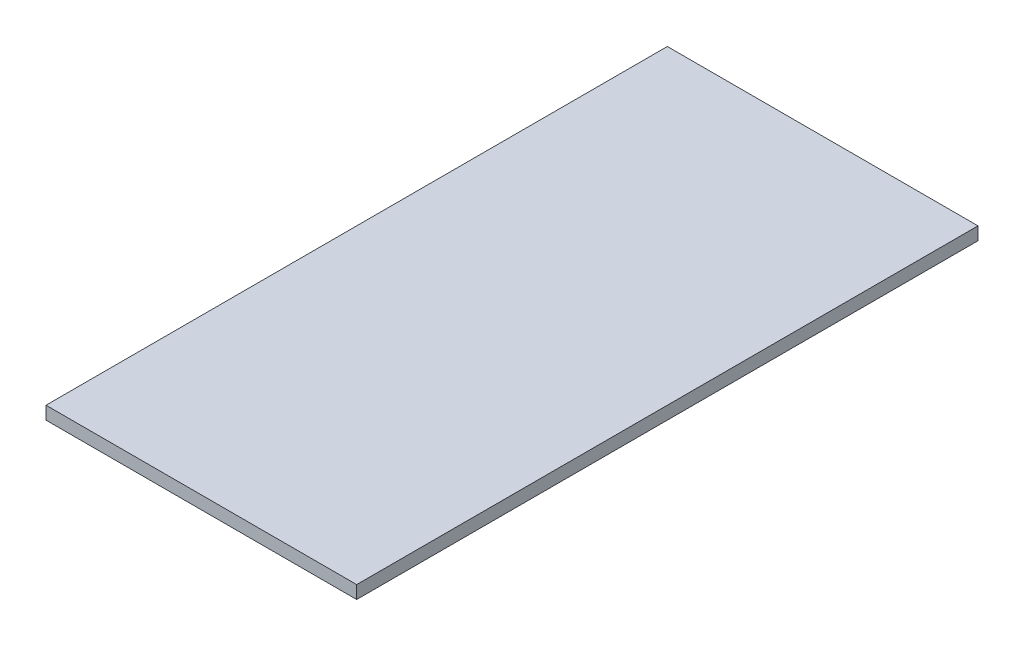
ISO-10303-21;
HEADER;
FILE_DESCRIPTION(('STEP AP214'),'2;1');
FILE_NAME('part.step','',(''),(''),'','','');
FILE_SCHEMA(('AUTOMOTIVE_DESIGN { 1 0 10303 214 1 1 1 1 }'));
ENDSEC;
DATA;
#1=APPLICATION_CONTEXT('core data for automotive mechanical design processes');
#2=APPLICATION_PROTOCOL_DEFINITION('international standard','automotive_design',2000,#1);
#3=PRODUCT_CONTEXT('',#1,'mechanical');
#4=PRODUCT('Part','Part','',(#3));
#5=PRODUCT_RELATED_PRODUCT_CATEGORY('part','',(#4));
#6=PRODUCT_DEFINITION_FORMATION('','',#4);
#7=PRODUCT_DEFINITION_CONTEXT('part definition',#1,'design');
#8=PRODUCT_DEFINITION('design','',#6,#7);
#9=PRODUCT_DEFINITION_SHAPE('','',#8);
#10=(LENGTH_UNIT() NAMED_UNIT(*) SI_UNIT(.MILLI.,.METRE.));
#11=(NAMED_UNIT(*) PLANE_ANGLE_UNIT() SI_UNIT($,.RADIAN.));
#12=(NAMED_UNIT(*) SI_UNIT($,.STERADIAN.) SOLID_ANGLE_UNIT());
#13=UNCERTAINTY_MEASURE_WITH_UNIT(LENGTH_MEASURE(1.E-05),#10,'distance_accuracy_value','');
#14=(GEOMETRIC_REPRESENTATION_CONTEXT(3) GLOBAL_UNCERTAINTY_ASSIGNED_CONTEXT((#13)) GLOBAL_UNIT_ASSIGNED_CONTEXT((#10,
#11,#12)) REPRESENTATION_CONTEXT('',''));
#15=CARTESIAN_POINT('',(0.,0.,0.));
#16=DIRECTION('',(0.,0.,1.));
#17=DIRECTION('',(1.,0.,0.));
#18=AXIS2_PLACEMENT_3D('',#15,#16,#17);
#19=CARTESIAN_POINT('',(0.,0.,0.));
#20=DIRECTION('',(0.,-1.,0.));
#21=DIRECTION('',(0.,0.,-1.));
#22=AXIS2_PLACEMENT_3D('',#19,#20,#21);
#23=PLANE('',#22);
#24=DIRECTION('',(0.,0.,-1.));
#25=VECTOR('',#24,1.);
#26=CARTESIAN_POINT('',(-38.1,0.,76.2));
#27=LINE('',#26,#25);
#28=CARTESIAN_POINT('',(-38.1,0.,76.2));
#29=VERTEX_POINT('',#28);
#30=CARTESIAN_POINT('',(-38.1,0.,-76.2));
#31=VERTEX_POINT('',#30);
#32=EDGE_CURVE('E56',#29,#31,#27,.T.);
#33=ORIENTED_EDGE('',*,*,#32,.T.);
#34=DIRECTION('',(1.,0.,0.));
#35=VECTOR('',#34,1.);
#36=CARTESIAN_POINT('',(-38.1,0.,-76.2));
#37=LINE('',#36,#35);
#38=CARTESIAN_POINT('',(38.1,0.,-76.2));
#39=VERTEX_POINT('',#38);
#40=EDGE_CURVE('E77',#31,#39,#37,.T.);
#41=ORIENTED_EDGE('',*,*,#40,.T.);
#42=DIRECTION('',(0.,0.,1.));
#43=VECTOR('',#42,1.);
#44=CARTESIAN_POINT('',(38.1,0.,76.2));
#45=LINE('',#44,#43);
#46=CARTESIAN_POINT('',(38.1,0.,76.2));
#47=VERTEX_POINT('',#46);
#48=EDGE_CURVE('E59',#39,#47,#45,.T.);
#49=ORIENTED_EDGE('',*,*,#48,.T.);
#50=DIRECTION('',(-1.,0.,0.));
#51=VECTOR('',#50,1.);
#52=CARTESIAN_POINT('',(-38.1,0.,76.2));
#53=LINE('',#52,#51);
#54=EDGE_CURVE('E20',#47,#29,#53,.T.);
#55=ORIENTED_EDGE('',*,*,#54,.T.);
#56=EDGE_LOOP('',(#33,#41,#49,#55));
#57=FACE_BOUND('',#56,.T.);
#58=ADVANCED_FACE('F17',(#57),#23,.T.);
#59=CARTESIAN_POINT('',(-38.1,3.175,76.2));
#60=DIRECTION('',(0.,0.,-1.));
#61=DIRECTION('',(-1.,0.,0.));
#62=AXIS2_PLACEMENT_3D('',#59,#60,#61);
#63=PLANE('',#62);
#64=DIRECTION('',(0.,1.,0.));
#65=VECTOR('',#64,1.);
#66=CARTESIAN_POINT('',(38.1,3.175,76.2));
#67=LINE('',#66,#65);
#68=CARTESIAN_POINT('',(38.1,3.175,76.2));
#69=VERTEX_POINT('',#68);
#70=EDGE_CURVE('E80',#47,#69,#67,.T.);
#71=ORIENTED_EDGE('',*,*,#70,.T.);
#72=DIRECTION('',(1.,0.,0.));
#73=VECTOR('',#72,1.);
#74=CARTESIAN_POINT('',(0.,3.175,76.2));
#75=LINE('',#74,#73);
#76=CARTESIAN_POINT('',(-38.1,3.175,76.2));
#77=VERTEX_POINT('',#76);
#78=EDGE_CURVE('E74',#69,#77,#75,.F.);
#79=ORIENTED_EDGE('',*,*,#78,.T.);
#80=DIRECTION('',(0.,1.,0.));
#81=VECTOR('',#80,1.);
#82=CARTESIAN_POINT('',(-38.1,3.175,76.2));
#83=LINE('',#82,#81);
#84=EDGE_CURVE('E64',#77,#29,#83,.F.);
#85=ORIENTED_EDGE('',*,*,#84,.T.);
#86=ORIENTED_EDGE('',*,*,#54,.F.);
#87=EDGE_LOOP('',(#71,#79,#85,#86));
#88=FACE_BOUND('',#87,.T.);
#89=ADVANCED_FACE('F73',(#88),#63,.F.);
#90=CARTESIAN_POINT('',(-38.1,3.175,76.2));
#91=DIRECTION('',(1.,0.,0.));
#92=DIRECTION('',(0.,0.,-1.));
#93=AXIS2_PLACEMENT_3D('',#90,#91,#92);
#94=PLANE('',#93);
#95=ORIENTED_EDGE('',*,*,#84,.F.);
#96=DIRECTION('',(0.,0.,-1.));
#97=VECTOR('',#96,1.);
#98=CARTESIAN_POINT('',(-38.1,3.175,0.));
#99=LINE('',#98,#97);
#100=CARTESIAN_POINT('',(-38.1,3.175,-76.2));
#101=VERTEX_POINT('',#100);
#102=EDGE_CURVE('E86',#77,#101,#99,.T.);
#103=ORIENTED_EDGE('',*,*,#102,.T.);
#104=DIRECTION('',(0.,1.,0.));
#105=VECTOR('',#104,1.);
#106=CARTESIAN_POINT('',(-38.1,3.175,-76.2));
#107=LINE('',#106,#105);
#108=EDGE_CURVE('E70',#101,#31,#107,.F.);
#109=ORIENTED_EDGE('',*,*,#108,.T.);
#110=ORIENTED_EDGE('',*,*,#32,.F.);
#111=EDGE_LOOP('',(#95,#103,#109,#110));
#112=FACE_BOUND('',#111,.T.);
#113=ADVANCED_FACE('F67',(#112),#94,.F.);
#114=CARTESIAN_POINT('',(-38.1,3.175,-76.2));
#115=DIRECTION('',(0.,0.,1.));
#116=DIRECTION('',(1.,0.,0.));
#117=AXIS2_PLACEMENT_3D('',#114,#115,#116);
#118=PLANE('',#117);
#119=ORIENTED_EDGE('',*,*,#108,.F.);
#120=DIRECTION('',(1.,0.,0.));
#121=VECTOR('',#120,1.);
#122=CARTESIAN_POINT('',(0.,3.175,-76.2));
#123=LINE('',#122,#121);
#124=CARTESIAN_POINT('',(38.1,3.175,-76.2));
#125=VERTEX_POINT('',#124);
#126=EDGE_CURVE('E27',#101,#125,#123,.T.);
#127=ORIENTED_EDGE('',*,*,#126,.T.);
#128=DIRECTION('',(0.,1.,0.));
#129=VECTOR('',#128,1.);
#130=CARTESIAN_POINT('',(38.1,3.175,-76.2));
#131=LINE('',#130,#129);
#132=EDGE_CURVE('E35',#125,#39,#131,.F.);
#133=ORIENTED_EDGE('',*,*,#132,.T.);
#134=ORIENTED_EDGE('',*,*,#40,.F.);
#135=EDGE_LOOP('',(#119,#127,#133,#134));
#136=FACE_BOUND('',#135,.T.);
#137=ADVANCED_FACE('F93',(#136),#118,.F.);
#138=CARTESIAN_POINT('',(38.1,3.175,76.2));
#139=DIRECTION('',(-1.,0.,0.));
#140=DIRECTION('',(0.,0.,1.));
#141=AXIS2_PLACEMENT_3D('',#138,#139,#140);
#142=PLANE('',#141);
#143=ORIENTED_EDGE('',*,*,#132,.F.);
#144=DIRECTION('',(0.,0.,-1.));
#145=VECTOR('',#144,1.);
#146=CARTESIAN_POINT('',(38.1,3.175,0.));
#147=LINE('',#146,#145);
#148=EDGE_CURVE('E11',#125,#69,#147,.F.);
#149=ORIENTED_EDGE('',*,*,#148,.T.);
#150=ORIENTED_EDGE('',*,*,#70,.F.);
#151=ORIENTED_EDGE('',*,*,#48,.F.);
#152=EDGE_LOOP('',(#143,#149,#150,#151));
#153=FACE_BOUND('',#152,.T.);
#154=ADVANCED_FACE('F96',(#153),#142,.F.);
#155=CARTESIAN_POINT('',(0.,3.175,0.));
#156=DIRECTION('',(0.,-1.,0.));
#157=DIRECTION('',(0.,0.,-1.));
#158=AXIS2_PLACEMENT_3D('',#155,#156,#157);
#159=PLANE('',#158);
#160=ORIENTED_EDGE('',*,*,#126,.F.);
#161=ORIENTED_EDGE('',*,*,#102,.F.);
#162=ORIENTED_EDGE('',*,*,#78,.F.);
#163=ORIENTED_EDGE('',*,*,#148,.F.);
#164=EDGE_LOOP('',(#160,#161,#162,#163));
#165=FACE_BOUND('',#164,.T.);
#166=ADVANCED_FACE('F95',(#165),#159,.F.);
#167=CLOSED_SHELL('',(#58,#89,#113,#137,#154,#166));
#168=MANIFOLD_SOLID_BREP('B1',#167);
#169=ADVANCED_BREP_SHAPE_REPRESENTATION('',(#18,#168),#14);
#170=SHAPE_DEFINITION_REPRESENTATION(#9,#169);
ENDSEC;
END-ISO-10303-21;
